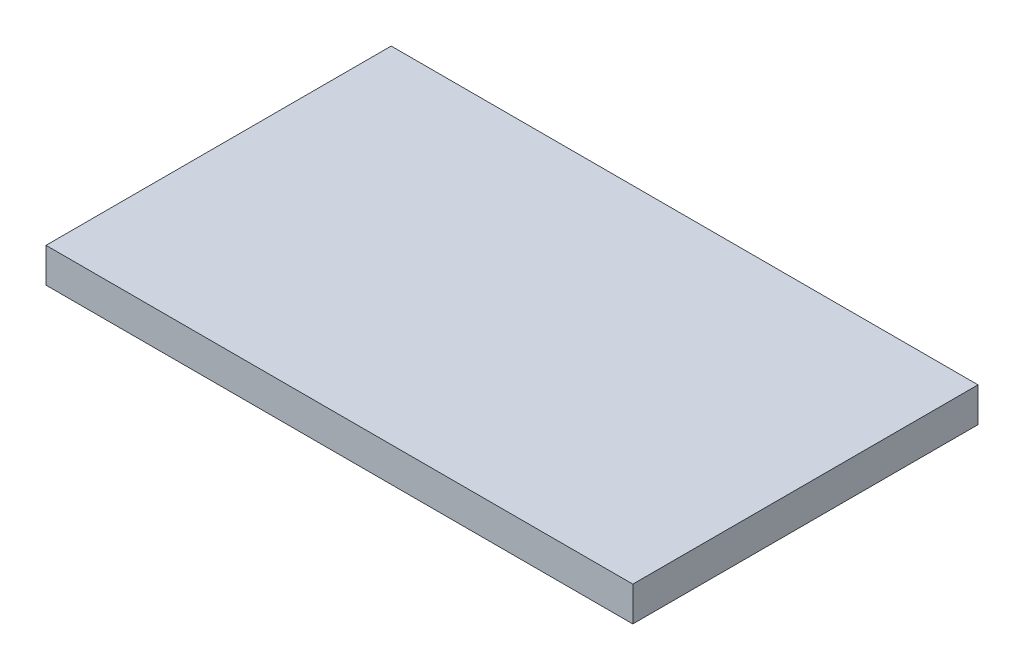
ISO-10303-21;
HEADER;
FILE_DESCRIPTION(('STEP AP214'),'2;1');
FILE_NAME('part.step','',(''),(''),'','','');
FILE_SCHEMA(('AUTOMOTIVE_DESIGN { 1 0 10303 214 1 1 1 1 }'));
ENDSEC;
DATA;
#1=APPLICATION_CONTEXT('core data for automotive mechanical design processes');
#2=APPLICATION_PROTOCOL_DEFINITION('international standard','automotive_design',2000,#1);
#3=PRODUCT_CONTEXT('',#1,'mechanical');
#4=PRODUCT('Part','Part','',(#3));
#5=PRODUCT_RELATED_PRODUCT_CATEGORY('part','',(#4));
#6=PRODUCT_DEFINITION_FORMATION('','',#4);
#7=PRODUCT_DEFINITION_CONTEXT('part definition',#1,'design');
#8=PRODUCT_DEFINITION('design','',#6,#7);
#9=PRODUCT_DEFINITION_SHAPE('','',#8);
#10=(LENGTH_UNIT() NAMED_UNIT(*) SI_UNIT(.MILLI.,.METRE.));
#11=(NAMED_UNIT(*) PLANE_ANGLE_UNIT() SI_UNIT($,.RADIAN.));
#12=(NAMED_UNIT(*) SI_UNIT($,.STERADIAN.) SOLID_ANGLE_UNIT());
#13=UNCERTAINTY_MEASURE_WITH_UNIT(LENGTH_MEASURE(1.E-05),#10,'distance_accuracy_value','');
#14=(GEOMETRIC_REPRESENTATION_CONTEXT(3) GLOBAL_UNCERTAINTY_ASSIGNED_CONTEXT((#13)) GLOBAL_UNIT_ASSIGNED_CONTEXT((#10,
#11,#12)) REPRESENTATION_CONTEXT('',''));
#15=CARTESIAN_POINT('',(0.,0.,0.));
#16=DIRECTION('',(0.,0.,1.));
#17=DIRECTION('',(1.,0.,0.));
#18=AXIS2_PLACEMENT_3D('',#15,#16,#17);
#19=CARTESIAN_POINT('',(85.,10.,50.));
#20=DIRECTION('',(-1.,0.,0.));
#21=DIRECTION('',(0.,0.,1.));
#22=AXIS2_PLACEMENT_3D('',#19,#20,#21);
#23=PLANE('',#22);
#24=DIRECTION('',(0.,0.,-1.));
#25=VECTOR('',#24,1.);
#26=CARTESIAN_POINT('',(85.,0.,50.));
#27=LINE('',#26,#25);
#28=CARTESIAN_POINT('',(85.,0.,50.));
#29=VERTEX_POINT('',#28);
#30=CARTESIAN_POINT('',(85.,0.,-50.));
#31=VERTEX_POINT('',#30);
#32=EDGE_CURVE('E100',#29,#31,#27,.T.);
#33=ORIENTED_EDGE('',*,*,#32,.T.);
#34=DIRECTION('',(0.,-1.,0.));
#35=VECTOR('',#34,1.);
#36=CARTESIAN_POINT('',(85.,10.,-50.));
#37=LINE('',#36,#35);
#38=CARTESIAN_POINT('',(85.,10.,-50.));
#39=VERTEX_POINT('',#38);
#40=EDGE_CURVE('E11',#39,#31,#37,.T.);
#41=ORIENTED_EDGE('',*,*,#40,.F.);
#42=DIRECTION('',(0.,0.,-1.));
#43=VECTOR('',#42,1.);
#44=CARTESIAN_POINT('',(85.,10.,50.));
#45=LINE('',#44,#43);
#46=CARTESIAN_POINT('',(85.,10.,50.));
#47=VERTEX_POINT('',#46);
#48=EDGE_CURVE('E88',#47,#39,#45,.T.);
#49=ORIENTED_EDGE('',*,*,#48,.F.);
#50=DIRECTION('',(0.,-1.,0.));
#51=VECTOR('',#50,1.);
#52=CARTESIAN_POINT('',(85.,10.,50.));
#53=LINE('',#52,#51);
#54=EDGE_CURVE('E96',#47,#29,#53,.T.);
#55=ORIENTED_EDGE('',*,*,#54,.T.);
#56=EDGE_LOOP('',(#33,#41,#49,#55));
#57=FACE_BOUND('',#56,.T.);
#58=ADVANCED_FACE('F37',(#57),#23,.F.);
#59=CARTESIAN_POINT('',(-85.,10.,-50.));
#60=DIRECTION('',(0.,0.,1.));
#61=DIRECTION('',(1.,0.,0.));
#62=AXIS2_PLACEMENT_3D('',#59,#60,#61);
#63=PLANE('',#62);
#64=DIRECTION('',(-1.,0.,0.));
#65=VECTOR('',#64,1.);
#66=CARTESIAN_POINT('',(-85.,0.,-50.));
#67=LINE('',#66,#65);
#68=CARTESIAN_POINT('',(-85.,0.,-50.));
#69=VERTEX_POINT('',#68);
#70=EDGE_CURVE('E92',#31,#69,#67,.T.);
#71=ORIENTED_EDGE('',*,*,#70,.T.);
#72=DIRECTION('',(0.,-1.,0.));
#73=VECTOR('',#72,1.);
#74=CARTESIAN_POINT('',(-85.,10.,-50.));
#75=LINE('',#74,#73);
#76=CARTESIAN_POINT('',(-85.,10.,-50.));
#77=VERTEX_POINT('',#76);
#78=EDGE_CURVE('E45',#77,#69,#75,.T.);
#79=ORIENTED_EDGE('',*,*,#78,.F.);
#80=DIRECTION('',(-1.,0.,0.));
#81=VECTOR('',#80,1.);
#82=CARTESIAN_POINT('',(-85.,10.,-50.));
#83=LINE('',#82,#81);
#84=EDGE_CURVE('E83',#39,#77,#83,.T.);
#85=ORIENTED_EDGE('',*,*,#84,.F.);
#86=ORIENTED_EDGE('',*,*,#40,.T.);
#87=EDGE_LOOP('',(#71,#79,#85,#86));
#88=FACE_BOUND('',#87,.T.);
#89=ADVANCED_FACE('F91',(#88),#63,.F.);
#90=CARTESIAN_POINT('',(-85.,10.,50.));
#91=DIRECTION('',(1.,0.,0.));
#92=DIRECTION('',(0.,0.,-1.));
#93=AXIS2_PLACEMENT_3D('',#90,#91,#92);
#94=PLANE('',#93);
#95=DIRECTION('',(0.,0.,1.));
#96=VECTOR('',#95,1.);
#97=CARTESIAN_POINT('',(-85.,0.,50.));
#98=LINE('',#97,#96);
#99=CARTESIAN_POINT('',(-85.,0.,50.));
#100=VERTEX_POINT('',#99);
#101=EDGE_CURVE('E70',#69,#100,#98,.T.);
#102=ORIENTED_EDGE('',*,*,#101,.T.);
#103=DIRECTION('',(0.,-1.,0.));
#104=VECTOR('',#103,1.);
#105=CARTESIAN_POINT('',(-85.,10.,50.));
#106=LINE('',#105,#104);
#107=CARTESIAN_POINT('',(-85.,10.,50.));
#108=VERTEX_POINT('',#107);
#109=EDGE_CURVE('E93',#108,#100,#106,.T.);
#110=ORIENTED_EDGE('',*,*,#109,.F.);
#111=DIRECTION('',(0.,0.,1.));
#112=VECTOR('',#111,1.);
#113=CARTESIAN_POINT('',(-85.,10.,50.));
#114=LINE('',#113,#112);
#115=EDGE_CURVE('E86',#77,#108,#114,.T.);
#116=ORIENTED_EDGE('',*,*,#115,.F.);
#117=ORIENTED_EDGE('',*,*,#78,.T.);
#118=EDGE_LOOP('',(#102,#110,#116,#117));
#119=FACE_BOUND('',#118,.T.);
#120=ADVANCED_FACE('F94',(#119),#94,.F.);
#121=CARTESIAN_POINT('',(-85.,10.,50.));
#122=DIRECTION('',(0.,0.,-1.));
#123=DIRECTION('',(-1.,0.,0.));
#124=AXIS2_PLACEMENT_3D('',#121,#122,#123);
#125=PLANE('',#124);
#126=DIRECTION('',(1.,0.,0.));
#127=VECTOR('',#126,1.);
#128=CARTESIAN_POINT('',(-85.,0.,50.));
#129=LINE('',#128,#127);
#130=EDGE_CURVE('E76',#100,#29,#129,.T.);
#131=ORIENTED_EDGE('',*,*,#130,.T.);
#132=ORIENTED_EDGE('',*,*,#54,.F.);
#133=DIRECTION('',(1.,0.,0.));
#134=VECTOR('',#133,1.);
#135=CARTESIAN_POINT('',(-85.,10.,50.));
#136=LINE('',#135,#134);
#137=EDGE_CURVE('E53',#108,#47,#136,.T.);
#138=ORIENTED_EDGE('',*,*,#137,.F.);
#139=ORIENTED_EDGE('',*,*,#109,.T.);
#140=EDGE_LOOP('',(#131,#132,#138,#139));
#141=FACE_BOUND('',#140,.T.);
#142=ADVANCED_FACE('F107',(#141),#125,.F.);
#143=CARTESIAN_POINT('',(0.,10.,0.));
#144=DIRECTION('',(0.,-1.,0.));
#145=DIRECTION('',(0.,0.,-1.));
#146=AXIS2_PLACEMENT_3D('',#143,#144,#145);
#147=PLANE('',#146);
#148=ORIENTED_EDGE('',*,*,#48,.T.);
#149=ORIENTED_EDGE('',*,*,#84,.T.);
#150=ORIENTED_EDGE('',*,*,#115,.T.);
#151=ORIENTED_EDGE('',*,*,#137,.T.);
#152=EDGE_LOOP('',(#148,#149,#150,#151));
#153=FACE_BOUND('',#152,.T.);
#154=ADVANCED_FACE('F84',(#153),#147,.F.);
#155=CARTESIAN_POINT('',(0.,0.,0.));
#156=DIRECTION('',(0.,-1.,0.));
#157=DIRECTION('',(0.,0.,-1.));
#158=AXIS2_PLACEMENT_3D('',#155,#156,#157);
#159=PLANE('',#158);
#160=ORIENTED_EDGE('',*,*,#32,.F.);
#161=ORIENTED_EDGE('',*,*,#130,.F.);
#162=ORIENTED_EDGE('',*,*,#101,.F.);
#163=ORIENTED_EDGE('',*,*,#70,.F.);
#164=EDGE_LOOP('',(#160,#161,#162,#163));
#165=FACE_BOUND('',#164,.T.);
#166=ADVANCED_FACE('F110',(#165),#159,.T.);
#167=CLOSED_SHELL('',(#58,#89,#120,#142,#154,#166));
#168=MANIFOLD_SOLID_BREP('B2',#167);
#169=ADVANCED_BREP_SHAPE_REPRESENTATION('',(#18,#168),#14);
#170=SHAPE_DEFINITION_REPRESENTATION(#9,#169);
ENDSEC;
END-ISO-10303-21;
